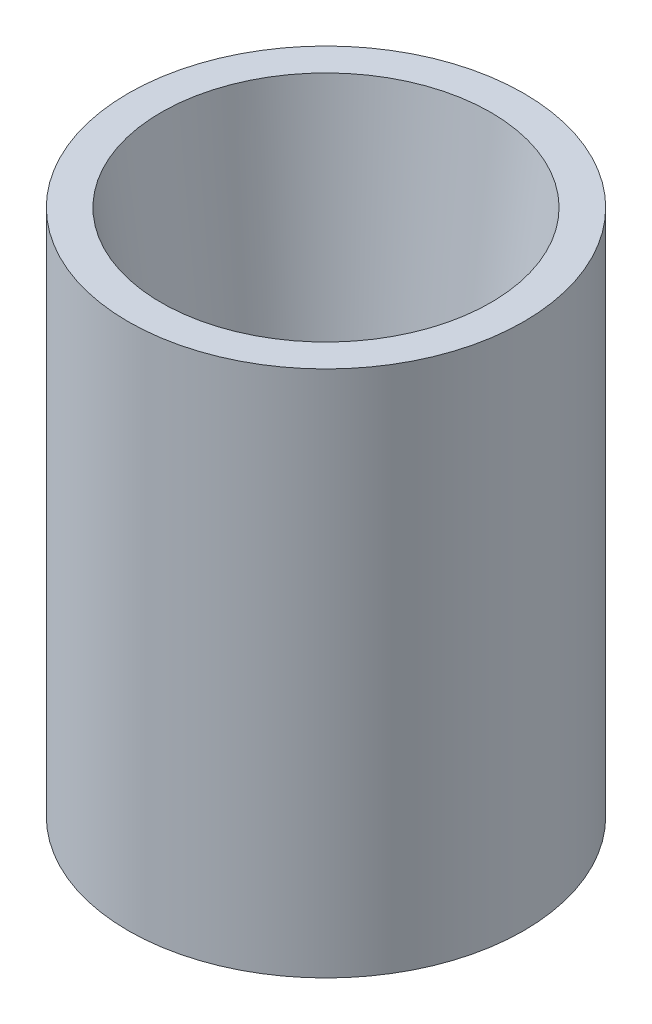
ISO-10303-21;
HEADER;
FILE_DESCRIPTION(('STEP AP214'),'2;1');
FILE_NAME('part.step','',(''),(''),'','','');
FILE_SCHEMA(('AUTOMOTIVE_DESIGN { 1 0 10303 214 1 1 1 1 }'));
ENDSEC;
DATA;
#1=APPLICATION_CONTEXT('core data for automotive mechanical design processes');
#2=APPLICATION_PROTOCOL_DEFINITION('international standard','automotive_design',2000,#1);
#3=PRODUCT_CONTEXT('',#1,'mechanical');
#4=PRODUCT('Part','Part','',(#3));
#5=PRODUCT_RELATED_PRODUCT_CATEGORY('part','',(#4));
#6=PRODUCT_DEFINITION_FORMATION('','',#4);
#7=PRODUCT_DEFINITION_CONTEXT('part definition',#1,'design');
#8=PRODUCT_DEFINITION('design','',#6,#7);
#9=PRODUCT_DEFINITION_SHAPE('','',#8);
#10=(LENGTH_UNIT() NAMED_UNIT(*) SI_UNIT(.MILLI.,.METRE.));
#11=(NAMED_UNIT(*) PLANE_ANGLE_UNIT() SI_UNIT($,.RADIAN.));
#12=(NAMED_UNIT(*) SI_UNIT($,.STERADIAN.) SOLID_ANGLE_UNIT());
#13=UNCERTAINTY_MEASURE_WITH_UNIT(LENGTH_MEASURE(1.E-05),#10,'distance_accuracy_value','');
#14=(GEOMETRIC_REPRESENTATION_CONTEXT(3) GLOBAL_UNCERTAINTY_ASSIGNED_CONTEXT((#13)) GLOBAL_UNIT_ASSIGNED_CONTEXT((#10,
#11,#12)) REPRESENTATION_CONTEXT('',''));
#15=CARTESIAN_POINT('',(0.,0.,0.));
#16=DIRECTION('',(0.,0.,1.));
#17=DIRECTION('',(1.,0.,0.));
#18=AXIS2_PLACEMENT_3D('',#15,#16,#17);
#19=CARTESIAN_POINT('',(0.,0.,0.));
#20=DIRECTION('',(0.,-1.,0.));
#21=DIRECTION('',(0.,0.,-1.));
#22=AXIS2_PLACEMENT_3D('',#19,#20,#21);
#23=PLANE('',#22);
#24=CARTESIAN_POINT('',(0.,0.,0.));
#25=DIRECTION('',(0.,-1.,0.));
#26=DIRECTION('',(0.,0.,-1.));
#27=AXIS2_PLACEMENT_3D('',#24,#25,#26);
#28=CIRCLE('',#27,30.);
#29=CARTESIAN_POINT('',(0.,0.,-30.));
#30=VERTEX_POINT('',#29);
#31=EDGE_CURVE('E10',#30,#30,#28,.T.);
#32=ORIENTED_EDGE('',*,*,#31,.T.);
#33=EDGE_LOOP('',(#32));
#34=FACE_BOUND('',#33,.T.);
#35=ADVANCED_FACE('F30',(#34),#23,.T.);
#36=CARTESIAN_POINT('',(0.,0.,0.));
#37=DIRECTION('',(0.,-1.,0.));
#38=DIRECTION('',(0.,0.,-1.));
#39=AXIS2_PLACEMENT_3D('',#36,#37,#38);
#40=CYLINDRICAL_SURFACE('',#39,30.);
#41=CARTESIAN_POINT('',(0.,80.,0.));
#42=DIRECTION('',(0.,-1.,0.));
#43=DIRECTION('',(0.,0.,-1.));
#44=AXIS2_PLACEMENT_3D('',#41,#42,#43);
#45=CIRCLE('',#44,30.);
#46=CARTESIAN_POINT('',(0.,80.,-30.));
#47=VERTEX_POINT('',#46);
#48=EDGE_CURVE('E36',#47,#47,#45,.T.);
#49=ORIENTED_EDGE('',*,*,#48,.T.);
#50=EDGE_LOOP('',(#49));
#51=FACE_BOUND('',#50,.T.);
#52=ORIENTED_EDGE('',*,*,#31,.F.);
#53=EDGE_LOOP('',(#52));
#54=FACE_BOUND('',#53,.T.);
#55=ADVANCED_FACE('F65',(#51,#54),#40,.T.);
#56=CARTESIAN_POINT('',(30.,80.,0.));
#57=DIRECTION('',(0.,1.,0.));
#58=DIRECTION('',(0.,0.,1.));
#59=AXIS2_PLACEMENT_3D('',#56,#57,#58);
#60=PLANE('',#59);
#61=CARTESIAN_POINT('',(0.,80.,0.));
#62=DIRECTION('',(0.,-1.,0.));
#63=DIRECTION('',(0.,0.,-1.));
#64=AXIS2_PLACEMENT_3D('',#61,#62,#63);
#65=CIRCLE('',#64,25.);
#66=CARTESIAN_POINT('',(0.,80.,-25.));
#67=VERTEX_POINT('',#66);
#68=EDGE_CURVE('E44',#67,#67,#65,.T.);
#69=ORIENTED_EDGE('',*,*,#68,.T.);
#70=EDGE_LOOP('',(#69));
#71=FACE_BOUND('',#70,.T.);
#72=ORIENTED_EDGE('',*,*,#48,.F.);
#73=EDGE_LOOP('',(#72));
#74=FACE_BOUND('',#73,.T.);
#75=ADVANCED_FACE('F50',(#71,#74),#60,.T.);
#76=CARTESIAN_POINT('',(0.,10.,0.));
#77=DIRECTION('',(0.,-1.,0.));
#78=DIRECTION('',(0.,0.,-1.));
#79=AXIS2_PLACEMENT_3D('',#76,#77,#78);
#80=PLANE('',#79);
#81=CARTESIAN_POINT('',(0.,10.,0.));
#82=DIRECTION('',(0.,-1.,0.));
#83=DIRECTION('',(0.,0.,-1.));
#84=AXIS2_PLACEMENT_3D('',#81,#82,#83);
#85=CIRCLE('',#84,16.4050807367967);
#86=CARTESIAN_POINT('',(0.,10.,-16.4050807367967));
#87=VERTEX_POINT('',#86);
#88=EDGE_CURVE('E40',#87,#87,#85,.T.);
#89=ORIENTED_EDGE('',*,*,#88,.F.);
#90=EDGE_LOOP('',(#89));
#91=FACE_BOUND('',#90,.T.);
#92=ADVANCED_FACE('F56',(#91),#80,.F.);
#93=CARTESIAN_POINT('',(0.,10.,0.));
#94=DIRECTION('',(0.,1.,0.));
#95=DIRECTION('',(0.,0.,1.));
#96=AXIS2_PLACEMENT_3D('',#93,#94,#95);
#97=CONICAL_SURFACE('',#96,16.4050807367967,0.122173047639603);
#98=ORIENTED_EDGE('',*,*,#68,.F.);
#99=EDGE_LOOP('',(#98));
#100=FACE_BOUND('',#99,.T.);
#101=ORIENTED_EDGE('',*,*,#88,.T.);
#102=EDGE_LOOP('',(#101));
#103=FACE_BOUND('',#102,.T.);
#104=ADVANCED_FACE('F53',(#100,#103),#97,.F.);
#105=CLOSED_SHELL('',(#35,#55,#75,#92,#104));
#106=MANIFOLD_SOLID_BREP('B2',#105);
#107=ADVANCED_BREP_SHAPE_REPRESENTATION('',(#18,#106),#14);
#108=SHAPE_DEFINITION_REPRESENTATION(#9,#107);
ENDSEC;
END-ISO-10303-21;
